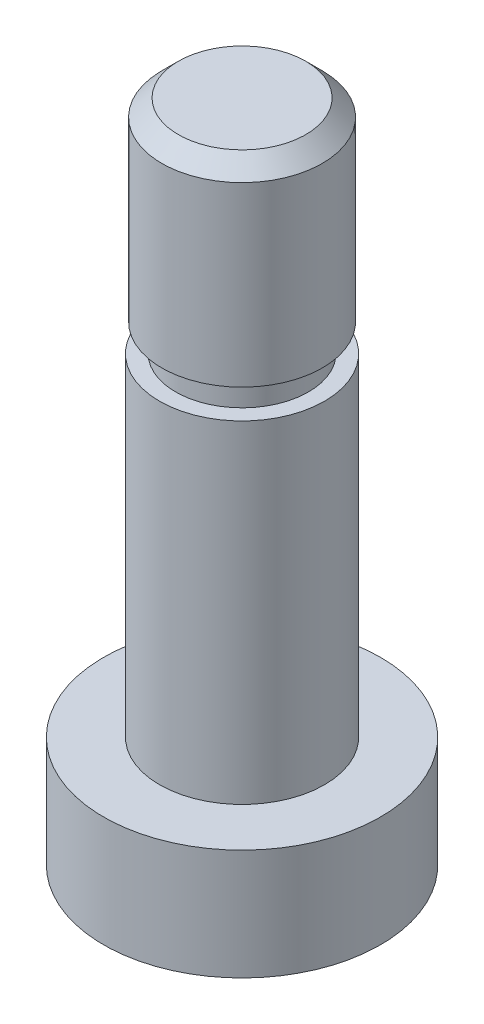
ISO-10303-21;
HEADER;
FILE_DESCRIPTION(('STEP AP214'),'2;1');
FILE_NAME('part.step','',(''),(''),'','','');
FILE_SCHEMA(('AUTOMOTIVE_DESIGN { 1 0 10303 214 1 1 1 1 }'));
ENDSEC;
DATA;
#1=APPLICATION_CONTEXT('core data for automotive mechanical design processes');
#2=APPLICATION_PROTOCOL_DEFINITION('international standard','automotive_design',2000,#1);
#3=PRODUCT_CONTEXT('',#1,'mechanical');
#4=PRODUCT('Part','Part','',(#3));
#5=PRODUCT_RELATED_PRODUCT_CATEGORY('part','',(#4));
#6=PRODUCT_DEFINITION_FORMATION('','',#4);
#7=PRODUCT_DEFINITION_CONTEXT('part definition',#1,'design');
#8=PRODUCT_DEFINITION('design','',#6,#7);
#9=PRODUCT_DEFINITION_SHAPE('','',#8);
#10=(LENGTH_UNIT() NAMED_UNIT(*) SI_UNIT(.MILLI.,.METRE.));
#11=(NAMED_UNIT(*) PLANE_ANGLE_UNIT() SI_UNIT($,.RADIAN.));
#12=(NAMED_UNIT(*) SI_UNIT($,.STERADIAN.) SOLID_ANGLE_UNIT());
#13=UNCERTAINTY_MEASURE_WITH_UNIT(LENGTH_MEASURE(1.E-05),#10,'distance_accuracy_value','');
#14=(GEOMETRIC_REPRESENTATION_CONTEXT(3) GLOBAL_UNCERTAINTY_ASSIGNED_CONTEXT((#13)) GLOBAL_UNIT_ASSIGNED_CONTEXT((#10,
#11,#12)) REPRESENTATION_CONTEXT('',''));
#15=CARTESIAN_POINT('',(0.,0.,0.));
#16=DIRECTION('',(0.,0.,1.));
#17=DIRECTION('',(1.,0.,0.));
#18=AXIS2_PLACEMENT_3D('',#15,#16,#17);
#19=CARTESIAN_POINT('',(0.,-2.,0.));
#20=DIRECTION('',(0.,-1.,0.));
#21=DIRECTION('',(0.,0.,-1.));
#22=AXIS2_PLACEMENT_3D('',#19,#20,#21);
#23=PLANE('',#22);
#24=CARTESIAN_POINT('',(0.,-2.,0.));
#25=DIRECTION('',(0.,-1.,0.));
#26=DIRECTION('',(0.,0.,-1.));
#27=AXIS2_PLACEMENT_3D('',#24,#25,#26);
#28=CIRCLE('',#27,2.5);
#29=CARTESIAN_POINT('',(0.,-2.,-2.5));
#30=VERTEX_POINT('',#29);
#31=EDGE_CURVE('E11',#30,#30,#28,.T.);
#32=ORIENTED_EDGE('',*,*,#31,.T.);
#33=EDGE_LOOP('',(#32));
#34=FACE_BOUND('',#33,.T.);
#35=DIRECTION('',(1.,0.,0.));
#36=VECTOR('',#35,1.);
#37=CARTESIAN_POINT('',(-0.577350269189626,-2.,1.));
#38=LINE('',#37,#36);
#39=CARTESIAN_POINT('',(-0.577350269189626,-2.,1.));
#40=VERTEX_POINT('',#39);
#41=CARTESIAN_POINT('',(0.577350269189637,-2.,0.999999999999994));
#42=VERTEX_POINT('',#41);
#43=EDGE_CURVE('E133',#40,#42,#38,.T.);
#44=ORIENTED_EDGE('',*,*,#43,.T.);
#45=DIRECTION('',(0.499999999999995,0.,-0.866025403784441));
#46=VECTOR('',#45,1.);
#47=CARTESIAN_POINT('',(0.577350269189637,-2.,0.999999999999993));
#48=LINE('',#47,#46);
#49=CARTESIAN_POINT('',(1.15470053837925,-2.,0.));
#50=VERTEX_POINT('',#49);
#51=EDGE_CURVE('E53',#42,#50,#48,.T.);
#52=ORIENTED_EDGE('',*,*,#51,.T.);
#53=DIRECTION('',(-0.500000000000001,0.,-0.866025403784438));
#54=VECTOR('',#53,1.);
#55=CARTESIAN_POINT('',(1.15470053837925,-2.,0.));
#56=LINE('',#55,#54);
#57=CARTESIAN_POINT('',(0.577350269189624,-2.,-1.));
#58=VERTEX_POINT('',#57);
#59=EDGE_CURVE('E124',#50,#58,#56,.T.);
#60=ORIENTED_EDGE('',*,*,#59,.T.);
#61=DIRECTION('',(-1.,0.,0.));
#62=VECTOR('',#61,1.);
#63=CARTESIAN_POINT('',(0.577350269189624,-2.,-1.));
#64=LINE('',#63,#62);
#65=CARTESIAN_POINT('',(-0.57735026918963,-2.,-0.999999999999998));
#66=VERTEX_POINT('',#65);
#67=EDGE_CURVE('E127',#58,#66,#64,.T.);
#68=ORIENTED_EDGE('',*,*,#67,.T.);
#69=DIRECTION('',(-0.499999999999998,0.,0.86602540378444));
#70=VECTOR('',#69,1.);
#71=CARTESIAN_POINT('',(-0.57735026918963,-2.,-0.999999999999998));
#72=LINE('',#71,#70);
#73=CARTESIAN_POINT('',(-1.15470053837925,-2.,0.));
#74=VERTEX_POINT('',#73);
#75=EDGE_CURVE('E130',#66,#74,#72,.T.);
#76=ORIENTED_EDGE('',*,*,#75,.T.);
#77=DIRECTION('',(0.5,0.,0.866025403784439));
#78=VECTOR('',#77,1.);
#79=CARTESIAN_POINT('',(-1.15470053837925,-2.,0.));
#80=LINE('',#79,#78);
#81=EDGE_CURVE('E114',#74,#40,#80,.T.);
#82=ORIENTED_EDGE('',*,*,#81,.T.);
#83=EDGE_LOOP('',(#44,#52,#60,#68,#76,#82));
#84=FACE_BOUND('',#83,.T.);
#85=ADVANCED_FACE('F39',(#34,#84),#23,.T.);
#86=CARTESIAN_POINT('',(0.,-4.,0.));
#87=DIRECTION('',(0.,-1.,0.));
#88=DIRECTION('',(0.,0.,-1.));
#89=AXIS2_PLACEMENT_3D('',#86,#87,#88);
#90=CYLINDRICAL_SURFACE('',#89,2.5);
#91=CARTESIAN_POINT('',(0.,0.,0.));
#92=DIRECTION('',(0.,-1.,0.));
#93=DIRECTION('',(0.,0.,-1.));
#94=AXIS2_PLACEMENT_3D('',#91,#92,#93);
#95=CIRCLE('',#94,2.5);
#96=CARTESIAN_POINT('',(0.,0.,-2.5));
#97=VERTEX_POINT('',#96);
#98=EDGE_CURVE('E46',#97,#97,#95,.T.);
#99=ORIENTED_EDGE('',*,*,#98,.T.);
#100=EDGE_LOOP('',(#99));
#101=FACE_BOUND('',#100,.T.);
#102=ORIENTED_EDGE('',*,*,#31,.F.);
#103=EDGE_LOOP('',(#102));
#104=FACE_BOUND('',#103,.T.);
#105=ADVANCED_FACE('F167',(#101,#104),#90,.T.);
#106=CARTESIAN_POINT('',(2.3,0.,0.));
#107=DIRECTION('',(0.,1.,0.));
#108=DIRECTION('',(0.,0.,1.));
#109=AXIS2_PLACEMENT_3D('',#106,#107,#108);
#110=PLANE('',#109);
#111=CARTESIAN_POINT('',(0.,0.,0.));
#112=DIRECTION('',(0.,-1.,0.));
#113=DIRECTION('',(0.,0.,-1.));
#114=AXIS2_PLACEMENT_3D('',#111,#112,#113);
#115=CIRCLE('',#114,1.49);
#116=CARTESIAN_POINT('',(0.,0.,-1.49));
#117=VERTEX_POINT('',#116);
#118=EDGE_CURVE('E162',#117,#117,#115,.T.);
#119=ORIENTED_EDGE('',*,*,#118,.T.);
#120=EDGE_LOOP('',(#119));
#121=FACE_BOUND('',#120,.T.);
#122=ORIENTED_EDGE('',*,*,#98,.F.);
#123=EDGE_LOOP('',(#122));
#124=FACE_BOUND('',#123,.T.);
#125=ADVANCED_FACE('F170',(#121,#124),#110,.T.);
#126=CARTESIAN_POINT('',(0.,-4.,0.));
#127=DIRECTION('',(0.,-1.,0.));
#128=DIRECTION('',(0.,0.,-1.));
#129=AXIS2_PLACEMENT_3D('',#126,#127,#128);
#130=CYLINDRICAL_SURFACE('',#129,1.49);
#131=CARTESIAN_POINT('',(0.,6.,0.));
#132=DIRECTION('',(0.,-1.,0.));
#133=DIRECTION('',(0.,0.,-1.));
#134=AXIS2_PLACEMENT_3D('',#131,#132,#133);
#135=CIRCLE('',#134,1.49);
#136=CARTESIAN_POINT('',(0.,6.,-1.49));
#137=VERTEX_POINT('',#136);
#138=EDGE_CURVE('E159',#137,#137,#135,.T.);
#139=ORIENTED_EDGE('',*,*,#138,.T.);
#140=EDGE_LOOP('',(#139));
#141=FACE_BOUND('',#140,.T.);
#142=ORIENTED_EDGE('',*,*,#118,.F.);
#143=EDGE_LOOP('',(#142));
#144=FACE_BOUND('',#143,.T.);
#145=ADVANCED_FACE('F172',(#141,#144),#130,.T.);
#146=CARTESIAN_POINT('',(1.49,6.,0.));
#147=DIRECTION('',(0.,1.,0.));
#148=DIRECTION('',(0.,0.,1.));
#149=AXIS2_PLACEMENT_3D('',#146,#147,#148);
#150=PLANE('',#149);
#151=CARTESIAN_POINT('',(0.,6.,0.));
#152=DIRECTION('',(0.,-1.,0.));
#153=DIRECTION('',(0.,0.,-1.));
#154=AXIS2_PLACEMENT_3D('',#151,#152,#153);
#155=CIRCLE('',#154,1.2);
#156=CARTESIAN_POINT('',(0.,6.,-1.2));
#157=VERTEX_POINT('',#156);
#158=EDGE_CURVE('E156',#157,#157,#155,.T.);
#159=ORIENTED_EDGE('',*,*,#158,.T.);
#160=EDGE_LOOP('',(#159));
#161=FACE_BOUND('',#160,.T.);
#162=ORIENTED_EDGE('',*,*,#138,.F.);
#163=EDGE_LOOP('',(#162));
#164=FACE_BOUND('',#163,.T.);
#165=ADVANCED_FACE('F179',(#161,#164),#150,.T.);
#166=CARTESIAN_POINT('',(0.,-4.,0.));
#167=DIRECTION('',(0.,-1.,0.));
#168=DIRECTION('',(0.,0.,-1.));
#169=AXIS2_PLACEMENT_3D('',#166,#167,#168);
#170=CYLINDRICAL_SURFACE('',#169,1.2);
#171=CARTESIAN_POINT('',(0.,6.5,0.));
#172=DIRECTION('',(0.,-1.,0.));
#173=DIRECTION('',(0.,0.,-1.));
#174=AXIS2_PLACEMENT_3D('',#171,#172,#173);
#175=CIRCLE('',#174,1.2);
#176=CARTESIAN_POINT('',(0.,6.5,-1.2));
#177=VERTEX_POINT('',#176);
#178=EDGE_CURVE('E153',#177,#177,#175,.T.);
#179=ORIENTED_EDGE('',*,*,#178,.T.);
#180=EDGE_LOOP('',(#179));
#181=FACE_BOUND('',#180,.T.);
#182=ORIENTED_EDGE('',*,*,#158,.F.);
#183=EDGE_LOOP('',(#182));
#184=FACE_BOUND('',#183,.T.);
#185=ADVANCED_FACE('F224',(#181,#184),#170,.T.);
#186=CARTESIAN_POINT('',(1.2,6.5,0.));
#187=DIRECTION('',(0.,-1.,0.));
#188=DIRECTION('',(0.,0.,-1.));
#189=AXIS2_PLACEMENT_3D('',#186,#187,#188);
#190=PLANE('',#189);
#191=CARTESIAN_POINT('',(0.,6.5,0.));
#192=DIRECTION('',(0.,-1.,0.));
#193=DIRECTION('',(0.,0.,-1.));
#194=AXIS2_PLACEMENT_3D('',#191,#192,#193);
#195=CIRCLE('',#194,1.45);
#196=CARTESIAN_POINT('',(0.,6.5,-1.45));
#197=VERTEX_POINT('',#196);
#198=EDGE_CURVE('E150',#197,#197,#195,.T.);
#199=ORIENTED_EDGE('',*,*,#198,.T.);
#200=EDGE_LOOP('',(#199));
#201=FACE_BOUND('',#200,.T.);
#202=ORIENTED_EDGE('',*,*,#178,.F.);
#203=EDGE_LOOP('',(#202));
#204=FACE_BOUND('',#203,.T.);
#205=ADVANCED_FACE('F220',(#201,#204),#190,.T.);
#206=CARTESIAN_POINT('',(0.,-4.,0.));
#207=DIRECTION('',(0.,-1.,0.));
#208=DIRECTION('',(0.,0.,-1.));
#209=AXIS2_PLACEMENT_3D('',#206,#207,#208);
#210=CYLINDRICAL_SURFACE('',#209,1.45);
#211=CARTESIAN_POINT('',(0.,9.7,0.));
#212=DIRECTION('',(0.,-1.,0.));
#213=DIRECTION('',(0.,0.,-1.));
#214=AXIS2_PLACEMENT_3D('',#211,#212,#213);
#215=CIRCLE('',#214,1.45);
#216=CARTESIAN_POINT('',(0.,9.7,-1.45));
#217=VERTEX_POINT('',#216);
#218=EDGE_CURVE('E147',#217,#217,#215,.T.);
#219=ORIENTED_EDGE('',*,*,#218,.T.);
#220=EDGE_LOOP('',(#219));
#221=FACE_BOUND('',#220,.T.);
#222=ORIENTED_EDGE('',*,*,#198,.F.);
#223=EDGE_LOOP('',(#222));
#224=FACE_BOUND('',#223,.T.);
#225=ADVANCED_FACE('F216',(#221,#224),#210,.T.);
#226=CARTESIAN_POINT('',(0.,9.7,0.));
#227=DIRECTION('',(0.,-1.,0.));
#228=DIRECTION('',(0.,0.,-1.));
#229=AXIS2_PLACEMENT_3D('',#226,#227,#228);
#230=CONICAL_SURFACE('',#229,1.45,0.785398163397448);
#231=CARTESIAN_POINT('',(0.,10.,0.));
#232=DIRECTION('',(0.,-1.,0.));
#233=DIRECTION('',(0.,0.,-1.));
#234=AXIS2_PLACEMENT_3D('',#231,#232,#233);
#235=CIRCLE('',#234,1.15);
#236=CARTESIAN_POINT('',(0.,10.,-1.15));
#237=VERTEX_POINT('',#236);
#238=EDGE_CURVE('E144',#237,#237,#235,.T.);
#239=ORIENTED_EDGE('',*,*,#238,.T.);
#240=EDGE_LOOP('',(#239));
#241=FACE_BOUND('',#240,.T.);
#242=ORIENTED_EDGE('',*,*,#218,.F.);
#243=EDGE_LOOP('',(#242));
#244=FACE_BOUND('',#243,.T.);
#245=ADVANCED_FACE('F212',(#241,#244),#230,.T.);
#246=CARTESIAN_POINT('',(1.15,10.,0.));
#247=DIRECTION('',(0.,1.,0.));
#248=DIRECTION('',(0.,0.,1.));
#249=AXIS2_PLACEMENT_3D('',#246,#247,#248);
#250=PLANE('',#249);
#251=ORIENTED_EDGE('',*,*,#238,.F.);
#252=EDGE_LOOP('',(#251));
#253=FACE_BOUND('',#252,.T.);
#254=ADVANCED_FACE('F207',(#253),#250,.T.);
#255=CARTESIAN_POINT('',(0.577350269189637,-0.7,0.999999999999993));
#256=DIRECTION('',(-0.866025403784441,0.,-0.499999999999995));
#257=DIRECTION('',(-0.499999999999995,0.,0.866025403784441));
#258=AXIS2_PLACEMENT_3D('',#255,#256,#257);
#259=PLANE('',#258);
#260=ORIENTED_EDGE('',*,*,#51,.F.);
#261=DIRECTION('',(0.,-1.,0.));
#262=VECTOR('',#261,1.);
#263=CARTESIAN_POINT('',(0.577350269189637,-0.7,0.999999999999993));
#264=LINE('',#263,#262);
#265=CARTESIAN_POINT('',(0.577350269189637,-0.7,0.999999999999993));
#266=VERTEX_POINT('',#265);
#267=EDGE_CURVE('E119',#266,#42,#264,.T.);
#268=ORIENTED_EDGE('',*,*,#267,.F.);
#269=DIRECTION('',(0.499999999999995,0.,-0.866025403784441));
#270=VECTOR('',#269,1.);
#271=CARTESIAN_POINT('',(0.577350269189637,-0.7,0.999999999999993));
#272=LINE('',#271,#270);
#273=CARTESIAN_POINT('',(1.15470053837925,-0.7,0.));
#274=VERTEX_POINT('',#273);
#275=EDGE_CURVE('E136',#266,#274,#272,.T.);
#276=ORIENTED_EDGE('',*,*,#275,.T.);
#277=DIRECTION('',(0.,-1.,0.));
#278=VECTOR('',#277,1.);
#279=CARTESIAN_POINT('',(1.15470053837925,-0.7,0.));
#280=LINE('',#279,#278);
#281=EDGE_CURVE('E142',#274,#50,#280,.T.);
#282=ORIENTED_EDGE('',*,*,#281,.T.);
#283=EDGE_LOOP('',(#260,#268,#276,#282));
#284=FACE_BOUND('',#283,.T.);
#285=ADVANCED_FACE('F191',(#284),#259,.T.);
#286=CARTESIAN_POINT('',(1.15470053837925,-0.7,0.));
#287=DIRECTION('',(-0.866025403784438,0.,0.500000000000001));
#288=DIRECTION('',(0.500000000000001,0.,0.866025403784438));
#289=AXIS2_PLACEMENT_3D('',#286,#287,#288);
#290=PLANE('',#289);
#291=ORIENTED_EDGE('',*,*,#59,.F.);
#292=ORIENTED_EDGE('',*,*,#281,.F.);
#293=DIRECTION('',(-0.500000000000001,0.,-0.866025403784438));
#294=VECTOR('',#293,1.);
#295=CARTESIAN_POINT('',(1.15470053837925,-0.7,0.));
#296=LINE('',#295,#294);
#297=CARTESIAN_POINT('',(0.577350269189624,-0.7,-1.));
#298=VERTEX_POINT('',#297);
#299=EDGE_CURVE('E92',#274,#298,#296,.T.);
#300=ORIENTED_EDGE('',*,*,#299,.T.);
#301=DIRECTION('',(0.,-1.,0.));
#302=VECTOR('',#301,1.);
#303=CARTESIAN_POINT('',(0.577350269189624,-0.7,-1.));
#304=LINE('',#303,#302);
#305=EDGE_CURVE('E140',#298,#58,#304,.T.);
#306=ORIENTED_EDGE('',*,*,#305,.T.);
#307=EDGE_LOOP('',(#291,#292,#300,#306));
#308=FACE_BOUND('',#307,.T.);
#309=ADVANCED_FACE('F200',(#308),#290,.T.);
#310=CARTESIAN_POINT('',(0.577350269189624,-0.7,-1.));
#311=DIRECTION('',(0.,0.,1.));
#312=DIRECTION('',(1.,0.,0.));
#313=AXIS2_PLACEMENT_3D('',#310,#311,#312);
#314=PLANE('',#313);
#315=ORIENTED_EDGE('',*,*,#67,.F.);
#316=ORIENTED_EDGE('',*,*,#305,.F.);
#317=DIRECTION('',(-1.,0.,0.));
#318=VECTOR('',#317,1.);
#319=CARTESIAN_POINT('',(0.577350269189624,-0.7,-1.));
#320=LINE('',#319,#318);
#321=CARTESIAN_POINT('',(-0.57735026918963,-0.7,-0.999999999999998));
#322=VERTEX_POINT('',#321);
#323=EDGE_CURVE('E110',#298,#322,#320,.T.);
#324=ORIENTED_EDGE('',*,*,#323,.T.);
#325=DIRECTION('',(0.,-1.,0.));
#326=VECTOR('',#325,1.);
#327=CARTESIAN_POINT('',(-0.57735026918963,-0.7,-0.999999999999998));
#328=LINE('',#327,#326);
#329=EDGE_CURVE('E107',#322,#66,#328,.T.);
#330=ORIENTED_EDGE('',*,*,#329,.T.);
#331=EDGE_LOOP('',(#315,#316,#324,#330));
#332=FACE_BOUND('',#331,.T.);
#333=ADVANCED_FACE('F198',(#332),#314,.T.);
#334=CARTESIAN_POINT('',(-0.57735026918963,-0.7,-0.999999999999998));
#335=DIRECTION('',(0.86602540378444,0.,0.499999999999998));
#336=DIRECTION('',(0.499999999999998,0.,-0.86602540378444));
#337=AXIS2_PLACEMENT_3D('',#334,#335,#336);
#338=PLANE('',#337);
#339=ORIENTED_EDGE('',*,*,#75,.F.);
#340=ORIENTED_EDGE('',*,*,#329,.F.);
#341=DIRECTION('',(-0.499999999999998,0.,0.86602540378444));
#342=VECTOR('',#341,1.);
#343=CARTESIAN_POINT('',(-0.57735026918963,-0.7,-0.999999999999998));
#344=LINE('',#343,#342);
#345=CARTESIAN_POINT('',(-1.15470053837925,-0.7,0.));
#346=VERTEX_POINT('',#345);
#347=EDGE_CURVE('E102',#322,#346,#344,.T.);
#348=ORIENTED_EDGE('',*,*,#347,.T.);
#349=DIRECTION('',(0.,-1.,0.));
#350=VECTOR('',#349,1.);
#351=CARTESIAN_POINT('',(-1.15470053837925,-0.7,0.));
#352=LINE('',#351,#350);
#353=EDGE_CURVE('E106',#346,#74,#352,.T.);
#354=ORIENTED_EDGE('',*,*,#353,.T.);
#355=EDGE_LOOP('',(#339,#340,#348,#354));
#356=FACE_BOUND('',#355,.T.);
#357=ADVANCED_FACE('F105',(#356),#338,.T.);
#358=CARTESIAN_POINT('',(-1.15470053837925,-0.7,0.));
#359=DIRECTION('',(0.866025403784439,0.,-0.5));
#360=DIRECTION('',(-0.5,0.,-0.866025403784439));
#361=AXIS2_PLACEMENT_3D('',#358,#359,#360);
#362=PLANE('',#361);
#363=ORIENTED_EDGE('',*,*,#81,.F.);
#364=ORIENTED_EDGE('',*,*,#353,.F.);
#365=DIRECTION('',(0.5,0.,0.866025403784439));
#366=VECTOR('',#365,1.);
#367=CARTESIAN_POINT('',(-1.15470053837925,-0.7,0.));
#368=LINE('',#367,#366);
#369=CARTESIAN_POINT('',(-0.577350269189626,-0.7,1.));
#370=VERTEX_POINT('',#369);
#371=EDGE_CURVE('E109',#346,#370,#368,.T.);
#372=ORIENTED_EDGE('',*,*,#371,.T.);
#373=DIRECTION('',(0.,-1.,0.));
#374=VECTOR('',#373,1.);
#375=CARTESIAN_POINT('',(-0.577350269189626,-0.7,1.));
#376=LINE('',#375,#374);
#377=EDGE_CURVE('E83',#370,#40,#376,.T.);
#378=ORIENTED_EDGE('',*,*,#377,.T.);
#379=EDGE_LOOP('',(#363,#364,#372,#378));
#380=FACE_BOUND('',#379,.T.);
#381=ADVANCED_FACE('F112',(#380),#362,.T.);
#382=CARTESIAN_POINT('',(-0.577350269189626,-0.7,1.));
#383=DIRECTION('',(0.,0.,-1.));
#384=DIRECTION('',(-1.,0.,0.));
#385=AXIS2_PLACEMENT_3D('',#382,#383,#384);
#386=PLANE('',#385);
#387=ORIENTED_EDGE('',*,*,#43,.F.);
#388=ORIENTED_EDGE('',*,*,#377,.F.);
#389=DIRECTION('',(1.,0.,0.));
#390=VECTOR('',#389,1.);
#391=CARTESIAN_POINT('',(-0.577350269189626,-0.7,1.));
#392=LINE('',#391,#390);
#393=EDGE_CURVE('E61',#370,#266,#392,.T.);
#394=ORIENTED_EDGE('',*,*,#393,.T.);
#395=ORIENTED_EDGE('',*,*,#267,.T.);
#396=EDGE_LOOP('',(#387,#388,#394,#395));
#397=FACE_BOUND('',#396,.T.);
#398=ADVANCED_FACE('F190',(#397),#386,.T.);
#399=CARTESIAN_POINT('',(0.,-0.7,0.));
#400=DIRECTION('',(0.,1.,0.));
#401=DIRECTION('',(0.,0.,1.));
#402=AXIS2_PLACEMENT_3D('',#399,#400,#401);
#403=PLANE('',#402);
#404=ORIENTED_EDGE('',*,*,#275,.F.);
#405=ORIENTED_EDGE('',*,*,#393,.F.);
#406=ORIENTED_EDGE('',*,*,#371,.F.);
#407=ORIENTED_EDGE('',*,*,#347,.F.);
#408=ORIENTED_EDGE('',*,*,#323,.F.);
#409=ORIENTED_EDGE('',*,*,#299,.F.);
#410=EDGE_LOOP('',(#404,#405,#406,#407,#408,#409));
#411=FACE_BOUND('',#410,.T.);
#412=ADVANCED_FACE('F117',(#411),#403,.F.);
#413=CLOSED_SHELL('',(#85,#105,#125,#145,#165,#185,#205,#225,#245,#254,#285,#309,#333,#357,#381,
#398,#412));
#414=MANIFOLD_SOLID_BREP('B2',#413);
#415=ADVANCED_BREP_SHAPE_REPRESENTATION('',(#18,#414),#14);
#416=SHAPE_DEFINITION_REPRESENTATION(#9,#415);
ENDSEC;
END-ISO-10303-21;
